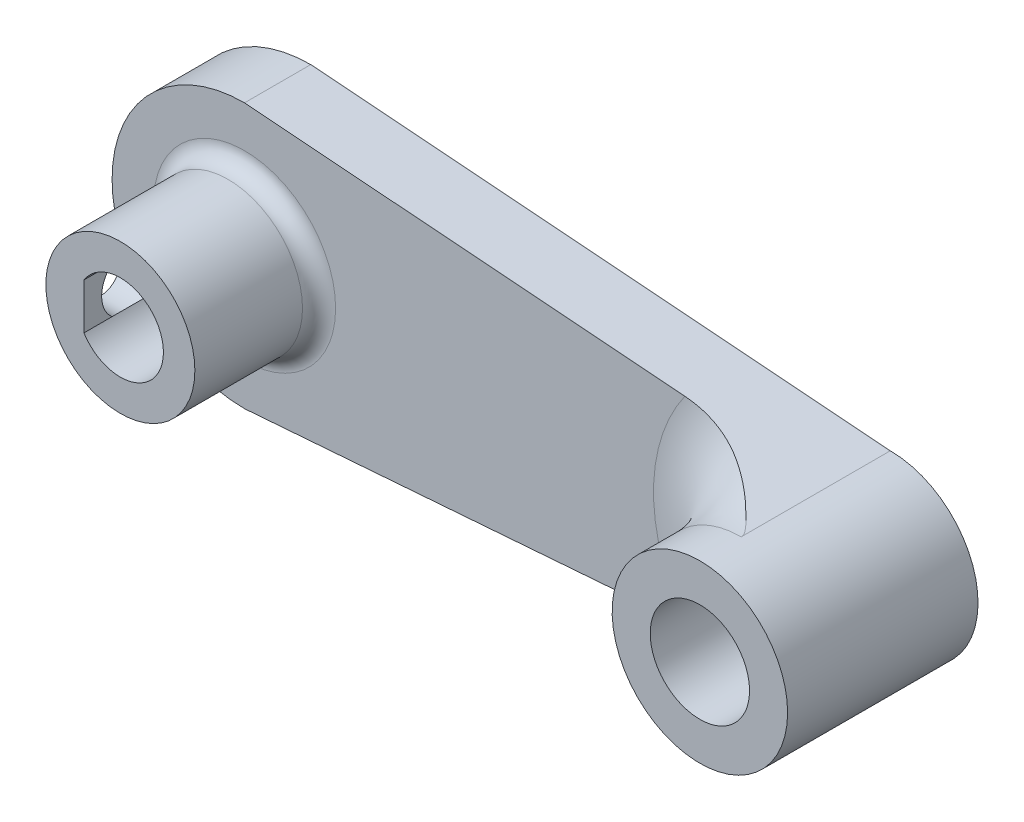
ISO-10303-21;
HEADER;
FILE_DESCRIPTION(('STEP AP214'),'2;1');
FILE_NAME('part.step','',(''),(''),'','','');
FILE_SCHEMA(('AUTOMOTIVE_DESIGN { 1 0 10303 214 1 1 1 1 }'));
ENDSEC;
DATA;
#1=APPLICATION_CONTEXT('core data for automotive mechanical design processes');
#2=APPLICATION_PROTOCOL_DEFINITION('international standard','automotive_design',2000,#1);
#3=PRODUCT_CONTEXT('',#1,'mechanical');
#4=PRODUCT('Part','Part','',(#3));
#5=PRODUCT_RELATED_PRODUCT_CATEGORY('part','',(#4));
#6=PRODUCT_DEFINITION_FORMATION('','',#4);
#7=PRODUCT_DEFINITION_CONTEXT('part definition',#1,'design');
#8=PRODUCT_DEFINITION('design','',#6,#7);
#9=PRODUCT_DEFINITION_SHAPE('','',#8);
#10=(LENGTH_UNIT() NAMED_UNIT(*) SI_UNIT(.MILLI.,.METRE.));
#11=(NAMED_UNIT(*) PLANE_ANGLE_UNIT() SI_UNIT($,.RADIAN.));
#12=(NAMED_UNIT(*) SI_UNIT($,.STERADIAN.) SOLID_ANGLE_UNIT());
#13=UNCERTAINTY_MEASURE_WITH_UNIT(LENGTH_MEASURE(1.E-05),#10,'distance_accuracy_value','');
#14=(GEOMETRIC_REPRESENTATION_CONTEXT(3) GLOBAL_UNCERTAINTY_ASSIGNED_CONTEXT((#13)) GLOBAL_UNIT_ASSIGNED_CONTEXT((#10,
#11,#12)) REPRESENTATION_CONTEXT('',''));
#15=CARTESIAN_POINT('',(0.,0.,0.));
#16=DIRECTION('',(0.,0.,1.));
#17=DIRECTION('',(1.,0.,0.));
#18=AXIS2_PLACEMENT_3D('',#15,#16,#17);
#19=CARTESIAN_POINT('',(-2.20040337211158,1.385,4.));
#20=DIRECTION('',(1.,0.,0.));
#21=DIRECTION('',(0.,0.,-1.));
#22=AXIS2_PLACEMENT_3D('',#19,#20,#21);
#23=PLANE('',#22);
#24=CARTESIAN_POINT('',(-2.20040337211158,0.,8.58156206194235));
#25=DIRECTION('',(1.,0.,0.));
#26=DIRECTION('',(0.,0.,-1.));
#27=AXIS2_PLACEMENT_3D('',#24,#25,#26);
#28=CIRCLE('',#27,1.85);
#29=CARTESIAN_POINT('',(-2.20040337211158,1.385,9.80805095304573));
#30=VERTEX_POINT('',#29);
#31=CARTESIAN_POINT('',(-2.20040337211158,-1.385,9.80805095304573));
#32=VERTEX_POINT('',#31);
#33=EDGE_CURVE('E138',#30,#32,#28,.T.);
#34=ORIENTED_EDGE('',*,*,#33,.F.);
#35=DIRECTION('',(0.,0.,-1.));
#36=VECTOR('',#35,1.);
#37=CARTESIAN_POINT('',(-2.20040337211158,1.385,4.));
#38=LINE('',#37,#36);
#39=CARTESIAN_POINT('',(-2.20040337211158,1.385,11.5));
#40=VERTEX_POINT('',#39);
#41=EDGE_CURVE('E150',#40,#30,#38,.T.);
#42=ORIENTED_EDGE('',*,*,#41,.F.);
#43=DIRECTION('',(0.,-1.,0.));
#44=VECTOR('',#43,1.);
#45=CARTESIAN_POINT('',(-2.20040337211158,1.385,11.5));
#46=LINE('',#45,#44);
#47=CARTESIAN_POINT('',(-2.20040337211158,-1.385,11.5));
#48=VERTEX_POINT('',#47);
#49=EDGE_CURVE('E312',#40,#48,#46,.T.);
#50=ORIENTED_EDGE('',*,*,#49,.T.);
#51=DIRECTION('',(0.,0.,-1.));
#52=VECTOR('',#51,1.);
#53=CARTESIAN_POINT('',(-2.20040337211158,-1.385,4.));
#54=LINE('',#53,#52);
#55=EDGE_CURVE('E148',#48,#32,#54,.T.);
#56=ORIENTED_EDGE('',*,*,#55,.T.);
#57=EDGE_LOOP('',(#34,#42,#50,#56));
#58=FACE_BOUND('',#57,.T.);
#59=ADVANCED_FACE('F41',(#58),#23,.T.);
#60=CARTESIAN_POINT('',(0.,0.,4.));
#61=DIRECTION('',(0.,0.,1.));
#62=DIRECTION('',(1.,0.,0.));
#63=AXIS2_PLACEMENT_3D('',#60,#61,#62);
#64=PLANE('',#63);
#65=CARTESIAN_POINT('',(0.,0.,4.));
#66=DIRECTION('',(0.,0.,1.));
#67=DIRECTION('',(1.,0.,0.));
#68=AXIS2_PLACEMENT_3D('',#65,#66,#67);
#69=CIRCLE('',#68,5.5);
#70=CARTESIAN_POINT('',(5.5,0.,4.));
#71=VERTEX_POINT('',#70);
#72=EDGE_CURVE('E206',#71,#71,#69,.F.);
#73=ORIENTED_EDGE('',*,*,#72,.T.);
#74=EDGE_LOOP('',(#73));
#75=FACE_BOUND('',#74,.T.);
#76=DIRECTION('',(0.997070106802791,0.0764931508062722,0.));
#77=VECTOR('',#76,1.);
#78=CARTESIAN_POINT('',(0.,-8.,4.));
#79=LINE('',#78,#77);
#80=CARTESIAN_POINT('',(0.,-8.,4.));
#81=VERTEX_POINT('',#80);
#82=CARTESIAN_POINT('',(26.5998702673474,-5.95931311759814,4.));
#83=VERTEX_POINT('',#82);
#84=EDGE_CURVE('E168',#81,#83,#79,.T.);
#85=ORIENTED_EDGE('',*,*,#84,.T.);
#86=CARTESIAN_POINT('',(35.,0.,4.));
#87=DIRECTION('',(0.,0.,1.));
#88=DIRECTION('',(1.,0.,0.));
#89=AXIS2_PLACEMENT_3D('',#86,#87,#88);
#90=CIRCLE('',#89,10.2993005762028);
#91=CARTESIAN_POINT('',(26.5919208086599,5.94809185126833,4.));
#92=VERTEX_POINT('',#91);
#93=EDGE_CURVE('E63',#83,#92,#90,.F.);
#94=ORIENTED_EDGE('',*,*,#93,.T.);
#95=DIRECTION('',(-0.997036176645934,0.0769341436506468,0.));
#96=VECTOR('',#95,1.);
#97=CARTESIAN_POINT('',(0.,8.,4.));
#98=LINE('',#97,#96);
#99=CARTESIAN_POINT('',(0.,8.,4.));
#100=VERTEX_POINT('',#99);
#101=EDGE_CURVE('E172',#92,#100,#98,.T.);
#102=ORIENTED_EDGE('',*,*,#101,.T.);
#103=CARTESIAN_POINT('',(0.,0.,4.));
#104=DIRECTION('',(0.,0.,1.));
#105=DIRECTION('',(1.,0.,0.));
#106=AXIS2_PLACEMENT_3D('',#103,#104,#105);
#107=CIRCLE('',#106,8.);
#108=EDGE_CURVE('E164',#100,#81,#107,.T.);
#109=ORIENTED_EDGE('',*,*,#108,.T.);
#110=EDGE_LOOP('',(#85,#94,#102,#109));
#111=FACE_BOUND('',#110,.T.);
#112=ADVANCED_FACE('F253',(#75,#111),#64,.T.);
#113=CARTESIAN_POINT('',(0.,0.,0.));
#114=DIRECTION('',(0.,0.,1.));
#115=DIRECTION('',(1.,0.,0.));
#116=AXIS2_PLACEMENT_3D('',#113,#114,#115);
#117=PLANE('',#116);
#118=CARTESIAN_POINT('',(35.,0.,0.));
#119=DIRECTION('',(0.,0.,1.));
#120=DIRECTION('',(1.,0.,0.));
#121=AXIS2_PLACEMENT_3D('',#118,#119,#120);
#122=CIRCLE('',#121,3.2);
#123=CARTESIAN_POINT('',(38.2,0.,0.));
#124=VERTEX_POINT('',#123);
#125=EDGE_CURVE('E156',#124,#124,#122,.T.);
#126=ORIENTED_EDGE('',*,*,#125,.T.);
#127=EDGE_LOOP('',(#126));
#128=FACE_BOUND('',#127,.T.);
#129=CARTESIAN_POINT('',(0.,0.,0.));
#130=DIRECTION('',(0.,0.,1.));
#131=DIRECTION('',(1.,0.,0.));
#132=AXIS2_PLACEMENT_3D('',#129,#130,#131);
#133=CIRCLE('',#132,8.);
#134=CARTESIAN_POINT('',(0.,8.,0.));
#135=VERTEX_POINT('',#134);
#136=CARTESIAN_POINT('',(0.,-8.,0.));
#137=VERTEX_POINT('',#136);
#138=EDGE_CURVE('E163',#135,#137,#133,.T.);
#139=ORIENTED_EDGE('',*,*,#138,.F.);
#140=DIRECTION('',(-0.997036176645934,0.0769341436506468,0.));
#141=VECTOR('',#140,1.);
#142=CARTESIAN_POINT('',(0.,8.,0.));
#143=LINE('',#142,#141);
#144=CARTESIAN_POINT('',(35.,5.2993005762028,0.));
#145=VERTEX_POINT('',#144);
#146=EDGE_CURVE('E169',#145,#135,#143,.T.);
#147=ORIENTED_EDGE('',*,*,#146,.F.);
#148=CARTESIAN_POINT('',(35.,0.,0.));
#149=DIRECTION('',(0.,0.,1.));
#150=DIRECTION('',(1.,0.,0.));
#151=AXIS2_PLACEMENT_3D('',#148,#149,#150);
#152=CIRCLE('',#151,5.2993005762028);
#153=CARTESIAN_POINT('',(35.4053601981432,-5.28377419149462,0.));
#154=VERTEX_POINT('',#153);
#155=EDGE_CURVE('E182',#154,#145,#152,.T.);
#156=ORIENTED_EDGE('',*,*,#155,.F.);
#157=DIRECTION('',(0.997070106802791,0.0764931508062722,0.));
#158=VECTOR('',#157,1.);
#159=CARTESIAN_POINT('',(0.,-8.,0.));
#160=LINE('',#159,#158);
#161=EDGE_CURVE('E179',#137,#154,#160,.T.);
#162=ORIENTED_EDGE('',*,*,#161,.F.);
#163=EDGE_LOOP('',(#139,#147,#156,#162));
#164=FACE_BOUND('',#163,.T.);
#165=CARTESIAN_POINT('',(0.,0.,0.));
#166=DIRECTION('',(0.,0.,1.));
#167=DIRECTION('',(1.,0.,0.));
#168=AXIS2_PLACEMENT_3D('',#165,#166,#167);
#169=CIRCLE('',#168,2.6);
#170=CARTESIAN_POINT('',(-2.20040337211158,-1.385,0.));
#171=VERTEX_POINT('',#170);
#172=CARTESIAN_POINT('',(-2.20040337211158,1.385,0.));
#173=VERTEX_POINT('',#172);
#174=EDGE_CURVE('E305',#171,#173,#169,.T.);
#175=ORIENTED_EDGE('',*,*,#174,.T.);
#176=DIRECTION('',(0.,-1.,0.));
#177=VECTOR('',#176,1.);
#178=CARTESIAN_POINT('',(-2.20040337211158,1.385,0.));
#179=LINE('',#178,#177);
#180=EDGE_CURVE('E143',#173,#171,#179,.T.);
#181=ORIENTED_EDGE('',*,*,#180,.T.);
#182=EDGE_LOOP('',(#175,#181));
#183=FACE_BOUND('',#182,.T.);
#184=ADVANCED_FACE('F258',(#128,#164,#183),#117,.F.);
#185=CARTESIAN_POINT('',(0.,0.,4.));
#186=DIRECTION('',(0.,0.,-1.));
#187=DIRECTION('',(-1.,0.,0.));
#188=AXIS2_PLACEMENT_3D('',#185,#186,#187);
#189=CYLINDRICAL_SURFACE('',#188,8.);
#190=ORIENTED_EDGE('',*,*,#138,.T.);
#191=DIRECTION('',(0.,0.,-1.));
#192=VECTOR('',#191,1.);
#193=CARTESIAN_POINT('',(0.,-8.,4.));
#194=LINE('',#193,#192);
#195=EDGE_CURVE('E198',#81,#137,#194,.T.);
#196=ORIENTED_EDGE('',*,*,#195,.F.);
#197=ORIENTED_EDGE('',*,*,#108,.F.);
#198=DIRECTION('',(0.,0.,-1.));
#199=VECTOR('',#198,1.);
#200=CARTESIAN_POINT('',(0.,8.,4.));
#201=LINE('',#200,#199);
#202=EDGE_CURVE('E175',#100,#135,#201,.T.);
#203=ORIENTED_EDGE('',*,*,#202,.T.);
#204=EDGE_LOOP('',(#190,#196,#197,#203));
#205=FACE_BOUND('',#204,.T.);
#206=ADVANCED_FACE('F270',(#205),#189,.T.);
#207=CARTESIAN_POINT('',(0.,-8.,4.));
#208=DIRECTION('',(-0.0764931508062722,0.997070106802791,0.));
#209=DIRECTION('',(-0.997070106802791,-0.0764931508062722,0.));
#210=AXIS2_PLACEMENT_3D('',#207,#208,#209);
#211=PLANE('',#210);
#212=ORIENTED_EDGE('',*,*,#161,.T.);
#213=DIRECTION('',(0.,0.,-1.));
#214=VECTOR('',#213,1.);
#215=CARTESIAN_POINT('',(35.4053601981432,-5.28377419149462,4.));
#216=LINE('',#215,#214);
#217=CARTESIAN_POINT('',(35.4053601981432,-5.28377419149462,9.));
#218=VERTEX_POINT('',#217);
#219=EDGE_CURVE('E194',#218,#154,#216,.T.);
#220=ORIENTED_EDGE('',*,*,#219,.F.);
#221=CARTESIAN_POINT('',(26.5998702673474,-5.95931311759814,4.));
#222=CARTESIAN_POINT('',(26.8132386211762,-5.9429439399893,3.99997392254403));
#223=CARTESIAN_POINT('',(27.0264846742696,-5.92658414503925,4.01009669839337));
#224=CARTESIAN_POINT('',(27.4509463745889,-5.89402032366653,4.04922944579764));
#225=CARTESIAN_POINT('',(27.6621645632361,-5.87781610227128,4.07821139459106));
#226=CARTESIAN_POINT('',(28.0789668038518,-5.84583989876233,4.15321756187651));
#227=CARTESIAN_POINT('',(28.2845878831228,-5.83006507599079,4.19903786066211));
#228=CARTESIAN_POINT('',(28.6917953620166,-5.79882496270292,4.30632586148612));
#229=CARTESIAN_POINT('',(28.8933797920704,-5.78335982328785,4.36780101042736));
#230=CARTESIAN_POINT('',(29.3744572623801,-5.74645255745486,4.53342856061496));
#231=CARTESIAN_POINT('',(29.6515230639646,-5.72519664375404,4.64470058661206));
#232=CARTESIAN_POINT('',(30.1946584009708,-5.68352842708766,4.89149070382841));
#233=CARTESIAN_POINT('',(30.4607241620949,-5.66311641367838,5.02701703349274));
#234=CARTESIAN_POINT('',(30.9827993475787,-5.62306388816092,5.31900980116569));
#235=CARTESIAN_POINT('',(31.2387529657888,-5.60342765738479,5.47557581134342));
#236=CARTESIAN_POINT('',(31.7398058723707,-5.56498791750733,5.80540470023674));
#237=CARTESIAN_POINT('',(31.9849001188991,-5.54618479520576,5.97867521845913));
#238=CARTESIAN_POINT('',(32.7925490747515,-5.48422364226673,6.58349516707241));
#239=CARTESIAN_POINT('',(33.3324613837962,-5.44280268962143,7.04517451614531));
#240=CARTESIAN_POINT('',(34.3798985112516,-5.36244548544504,8.00116907598813));
#241=CARTESIAN_POINT('',(34.8874528591123,-5.32350696847577,8.49545366836865));
#242=CARTESIAN_POINT('',(35.3984182836361,-5.28430676077902,8.99323715916587));
#243=CARTESIAN_POINT('',(35.401889239753,-5.28404047622403,8.99661857945717));
#244=CARTESIAN_POINT('',(35.4053601981432,-5.28377419149462,9.));
#245=B_SPLINE_CURVE_WITH_KNOTS('',3,(#221,#222,#223,#224,#225,#226,#227,#228,#229,#230,#231,
#232,#233,#234,#235,#236,#237,#238,#239,#240,#241,#242,#243,#244),.UNSPECIFIED.,.F.,.F.,(4,2,2,
2,2,2,2,2,2,2,2,4),(0.,0.641567182247231,1.28218323280429,1.91528391101597,2.54868631520907,
3.44524394732992,4.34210669265903,5.24337410978046,6.14505567850509,8.27576141205359,
10.4044940037782,10.4190532627927),.UNSPECIFIED.);
#246=EDGE_CURVE('E56',#218,#83,#245,.F.);
#247=ORIENTED_EDGE('',*,*,#246,.T.);
#248=ORIENTED_EDGE('',*,*,#84,.F.);
#249=ORIENTED_EDGE('',*,*,#195,.T.);
#250=EDGE_LOOP('',(#212,#220,#247,#248,#249));
#251=FACE_BOUND('',#250,.T.);
#252=ADVANCED_FACE('F279',(#251),#211,.F.);
#253=CARTESIAN_POINT('',(35.,0.,4.));
#254=DIRECTION('',(0.,0.,-1.));
#255=DIRECTION('',(-1.,0.,0.));
#256=AXIS2_PLACEMENT_3D('',#253,#254,#255);
#257=CYLINDRICAL_SURFACE('',#256,5.2993005762028);
#258=CARTESIAN_POINT('',(35.,0.,9.));
#259=DIRECTION('',(0.,0.,1.));
#260=DIRECTION('',(1.,0.,0.));
#261=AXIS2_PLACEMENT_3D('',#258,#259,#260);
#262=CIRCLE('',#261,5.2993005762028);
#263=CARTESIAN_POINT('',(35.,5.2993005762028,9.));
#264=VERTEX_POINT('',#263);
#265=EDGE_CURVE('E210',#264,#218,#262,.T.);
#266=ORIENTED_EDGE('',*,*,#265,.T.);
#267=ORIENTED_EDGE('',*,*,#219,.T.);
#268=ORIENTED_EDGE('',*,*,#155,.T.);
#269=DIRECTION('',(0.,0.,-1.));
#270=VECTOR('',#269,1.);
#271=CARTESIAN_POINT('',(35.,5.2993005762028,4.));
#272=LINE('',#271,#270);
#273=EDGE_CURVE('E190',#264,#145,#272,.T.);
#274=ORIENTED_EDGE('',*,*,#273,.F.);
#275=EDGE_LOOP('',(#266,#267,#268,#274));
#276=FACE_BOUND('',#275,.T.);
#277=CARTESIAN_POINT('',(35.,0.,11.5));
#278=DIRECTION('',(0.,0.,1.));
#279=DIRECTION('',(1.,0.,0.));
#280=AXIS2_PLACEMENT_3D('',#277,#278,#279);
#281=CIRCLE('',#280,5.2993005762028);
#282=CARTESIAN_POINT('',(40.2993005762028,0.,11.5));
#283=VERTEX_POINT('',#282);
#284=EDGE_CURVE('E325',#283,#283,#281,.T.);
#285=ORIENTED_EDGE('',*,*,#284,.F.);
#286=EDGE_LOOP('',(#285));
#287=FACE_BOUND('',#286,.T.);
#288=ADVANCED_FACE('F275',(#276,#287),#257,.T.);
#289=CARTESIAN_POINT('',(0.,8.,4.));
#290=DIRECTION('',(-0.0769341436506468,-0.997036176645934,0.));
#291=DIRECTION('',(0.997036176645934,-0.0769341436506468,0.));
#292=AXIS2_PLACEMENT_3D('',#289,#290,#291);
#293=PLANE('',#292);
#294=ORIENTED_EDGE('',*,*,#146,.T.);
#295=ORIENTED_EDGE('',*,*,#202,.F.);
#296=ORIENTED_EDGE('',*,*,#101,.F.);
#297=CARTESIAN_POINT('',(26.5919208086599,5.94809185126833,4.));
#298=CARTESIAN_POINT('',(26.8051605842276,5.93163766443957,3.99997389542849));
#299=CARTESIAN_POINT('',(27.0182785301913,5.91519287832915,4.01010673630318));
#300=CARTESIAN_POINT('',(27.4424816669492,5.88246015927157,4.0492874131764));
#301=CARTESIAN_POINT('',(27.6535693822087,5.86617203152951,4.07830746477213));
#302=CARTESIAN_POINT('',(28.0703811226492,5.83400965360839,4.15347518646677));
#303=CARTESIAN_POINT('',(28.2761380883871,5.81813286164237,4.19944178272287));
#304=CARTESIAN_POINT('',(28.6835823197541,5.78669330733145,4.30710423472807));
#305=CARTESIAN_POINT('',(28.8852676388674,5.77113069518523,4.36880743003734));
#306=CARTESIAN_POINT('',(29.3639854033241,5.7341914725958,4.53420622386028));
#307=CARTESIAN_POINT('',(29.6386554992673,5.712997147743,4.64480611106799));
#308=CARTESIAN_POINT('',(30.1770854976113,5.6714503595635,4.89003145259013));
#309=CARTESIAN_POINT('',(30.4408414459516,5.65109820134333,5.02466552192758));
#310=CARTESIAN_POINT('',(30.958037111555,5.61118991459803,5.31462430523333));
#311=CARTESIAN_POINT('',(31.2114333181569,5.59163714347911,5.47002649731549));
#312=CARTESIAN_POINT('',(31.7071533141849,5.55338598040375,5.79745658625287));
#313=CARTESIAN_POINT('',(31.9494792251469,5.53468742474358,5.96948127768369));
#314=CARTESIAN_POINT('',(32.4055202504863,5.49949800376181,6.31300470289831));
#315=CARTESIAN_POINT('',(32.6199932812932,5.48294865545551,6.48349954008582));
#316=CARTESIAN_POINT('',(33.0409910265507,5.4504632735116,6.83345244130637));
#317=CARTESIAN_POINT('',(33.2475268113917,5.43452638565121,7.0128971550213));
#318=CARTESIAN_POINT('',(33.5805818475522,5.40882691295832,7.31350048063011));
#319=CARTESIAN_POINT('',(33.7091477193419,5.39890640507653,7.43239401042852));
#320=CARTESIAN_POINT('',(33.9633465610935,5.37929170034943,7.67319741749072));
#321=CARTESIAN_POINT('',(34.0889808070951,5.36959740504127,7.7951059329703));
#322=CARTESIAN_POINT('',(34.2853989278592,5.3544412248821,7.99174637845935));
#323=CARTESIAN_POINT('',(34.3574434082321,5.34888206812122,8.0652085923432));
#324=CARTESIAN_POINT('',(34.4996468355534,5.33790924771469,8.21421459419294));
#325=CARTESIAN_POINT('',(34.5698020665728,5.33249587080068,8.28976196575932));
#326=CARTESIAN_POINT('',(34.690450386053,5.32318630374632,8.42657669618301));
#327=CARTESIAN_POINT('',(34.7417421132749,5.3192284883705,8.48711183823271));
#328=CARTESIAN_POINT('',(34.8146157810322,5.31360534915559,8.581081955263));
#329=CARTESIAN_POINT('',(34.8382214100703,5.31178387176296,8.61292041436684));
#330=CARTESIAN_POINT('',(34.8831100224831,5.30832013891502,8.67818363758521));
#331=CARTESIAN_POINT('',(34.9043967512895,5.30667759445153,8.7116057146904));
#332=CARTESIAN_POINT('',(34.9380569226609,5.30408028001074,8.77225313555896));
#333=CARTESIAN_POINT('',(34.9513322237828,5.3030559200653,8.79896336673625));
#334=CARTESIAN_POINT('',(34.9739636957225,5.30130961140166,8.85388544195868));
#335=CARTESIAN_POINT('',(34.9833485459243,5.30058544970073,8.88208450476221));
#336=CARTESIAN_POINT('',(34.9931202715783,5.29983143559092,8.92548061642464));
#337=CARTESIAN_POINT('',(34.9956612695484,5.29963536496939,8.94018687011352));
#338=CARTESIAN_POINT('',(34.9991191773591,5.29936854297991,8.96992039151783));
#339=CARTESIAN_POINT('',(35.0000213913867,5.29929892558264,8.9849493527923));
#340=CARTESIAN_POINT('',(35.,5.2993005762028,9.));
#341=B_SPLINE_CURVE_WITH_KNOTS('',3,(#297,#298,#299,#300,#301,#302,#303,#304,#305,#306,#307,
#308,#309,#310,#311,#312,#313,#314,#315,#316,#317,#318,#319,#320,#321,#322,#323,#324,#325,#326,
#327,#328,#329,#330,#331,#332,#333,#334,#335,#336,#337,#338,#339,#340),.UNSPECIFIED.,.F.,.F.,(4,
2,2,2,2,2,2,2,2,2,2,2,2,2,2,2,2,2,2,2,2,4),(0.,0.641202171131687,1.28146321474307,
1.91507248375818,2.54897781071211,3.4381413483161,4.32762424782039,5.22052327293435,
6.11325045685485,6.93640184446374,7.7583600826152,8.28450560013555,8.81041766279523,
9.11952342755051,9.42919832543136,9.66734408172639,9.78632575414892,9.90511230814192,
9.99448205851119,10.0831807515254,10.1278708354375,10.1729597360964),.UNSPECIFIED.);
#342=EDGE_CURVE('E11',#92,#264,#341,.T.);
#343=ORIENTED_EDGE('',*,*,#342,.T.);
#344=ORIENTED_EDGE('',*,*,#273,.T.);
#345=EDGE_LOOP('',(#294,#295,#296,#343,#344));
#346=FACE_BOUND('',#345,.T.);
#347=ADVANCED_FACE('F266',(#346),#293,.F.);
#348=CARTESIAN_POINT('',(35.,0.,4.));
#349=DIRECTION('',(0.,0.,-1.));
#350=DIRECTION('',(-1.,0.,0.));
#351=AXIS2_PLACEMENT_3D('',#348,#349,#350);
#352=CYLINDRICAL_SURFACE('',#351,3.2);
#353=CARTESIAN_POINT('',(35.,0.,4.));
#354=DIRECTION('',(0.,0.,1.));
#355=DIRECTION('',(1.,0.,0.));
#356=AXIS2_PLACEMENT_3D('',#353,#354,#355);
#357=CIRCLE('',#356,3.2);
#358=CARTESIAN_POINT('',(38.2,0.,4.));
#359=VERTEX_POINT('',#358);
#360=EDGE_CURVE('E321',#359,#359,#357,.T.);
#361=ORIENTED_EDGE('',*,*,#360,.T.);
#362=EDGE_LOOP('',(#361));
#363=FACE_BOUND('',#362,.T.);
#364=ORIENTED_EDGE('',*,*,#125,.F.);
#365=EDGE_LOOP('',(#364));
#366=FACE_BOUND('',#365,.T.);
#367=ADVANCED_FACE('F264',(#363,#366),#352,.F.);
#368=CARTESIAN_POINT('',(0.,0.,4.));
#369=DIRECTION('',(0.,0.,-1.));
#370=DIRECTION('',(-1.,0.,0.));
#371=AXIS2_PLACEMENT_3D('',#368,#369,#370);
#372=CYLINDRICAL_SURFACE('',#371,2.6);
#373=ORIENTED_EDGE('',*,*,#174,.F.);
#374=CARTESIAN_POINT('',(-2.20040337211158,-1.385,7.35507317083897));
#375=VERTEX_POINT('',#374);
#376=EDGE_CURVE('E311',#375,#171,#54,.T.);
#377=ORIENTED_EDGE('',*,*,#376,.F.);
#378=EDGE_CURVE('E341',#32,#375,#54,.T.);
#379=ORIENTED_EDGE('',*,*,#378,.F.);
#380=ORIENTED_EDGE('',*,*,#55,.F.);
#381=CARTESIAN_POINT('',(0.,0.,11.5));
#382=DIRECTION('',(0.,0.,1.));
#383=DIRECTION('',(-1.,0.,0.));
#384=AXIS2_PLACEMENT_3D('',#381,#382,#383);
#385=CIRCLE('',#384,2.6);
#386=EDGE_CURVE('E318',#48,#40,#385,.T.);
#387=ORIENTED_EDGE('',*,*,#386,.T.);
#388=ORIENTED_EDGE('',*,*,#41,.T.);
#389=CARTESIAN_POINT('',(-2.20040337211158,1.385,7.35507317083897));
#390=VERTEX_POINT('',#389);
#391=EDGE_CURVE('E135',#30,#390,#38,.T.);
#392=ORIENTED_EDGE('',*,*,#391,.T.);
#393=EDGE_CURVE('E140',#390,#173,#38,.T.);
#394=ORIENTED_EDGE('',*,*,#393,.T.);
#395=EDGE_LOOP('',(#373,#377,#379,#380,#387,#388,#392,#394));
#396=FACE_BOUND('',#395,.T.);
#397=ADVANCED_FACE('F152',(#396),#372,.F.);
#398=EDGE_CURVE('E118',#375,#390,#28,.T.);
#399=ORIENTED_EDGE('',*,*,#398,.F.);
#400=ORIENTED_EDGE('',*,*,#376,.T.);
#401=ORIENTED_EDGE('',*,*,#180,.F.);
#402=ORIENTED_EDGE('',*,*,#393,.F.);
#403=EDGE_LOOP('',(#399,#400,#401,#402));
#404=FACE_BOUND('',#403,.T.);
#405=ADVANCED_FACE('F141',(#404),#23,.T.);
#406=CARTESIAN_POINT('',(0.,0.,11.5));
#407=DIRECTION('',(0.,0.,1.));
#408=DIRECTION('',(1.,0.,0.));
#409=AXIS2_PLACEMENT_3D('',#406,#407,#408);
#410=PLANE('',#409);
#411=CARTESIAN_POINT('',(0.,0.,11.5));
#412=DIRECTION('',(0.,0.,1.));
#413=DIRECTION('',(1.,0.,0.));
#414=AXIS2_PLACEMENT_3D('',#411,#412,#413);
#415=CIRCLE('',#414,4.5);
#416=CARTESIAN_POINT('',(4.5,0.,11.5));
#417=VERTEX_POINT('',#416);
#418=EDGE_CURVE('E307',#417,#417,#415,.T.);
#419=ORIENTED_EDGE('',*,*,#418,.T.);
#420=EDGE_LOOP('',(#419));
#421=FACE_BOUND('',#420,.T.);
#422=ORIENTED_EDGE('',*,*,#49,.F.);
#423=ORIENTED_EDGE('',*,*,#386,.F.);
#424=EDGE_LOOP('',(#422,#423));
#425=FACE_BOUND('',#424,.T.);
#426=ADVANCED_FACE('F242',(#421,#425),#410,.T.);
#427=CARTESIAN_POINT('',(0.,0.,11.5));
#428=DIRECTION('',(0.,0.,-1.));
#429=DIRECTION('',(-1.,0.,0.));
#430=AXIS2_PLACEMENT_3D('',#427,#428,#429);
#431=CYLINDRICAL_SURFACE('',#430,4.5);
#432=CARTESIAN_POINT('',(-4.5,0.,10.4315620619424));
#433=CARTESIAN_POINT('',(-4.49999236049547,-0.0992099846473282,10.431551846103));
#434=CARTESIAN_POINT('',(-4.49668093327062,-0.198581616826438,10.4235341043957));
#435=CARTESIAN_POINT('',(-4.48375548698992,-0.39451363999919,10.3917453058325));
#436=CARTESIAN_POINT('',(-4.47412478528336,-0.491065881222446,10.367932548905));
#437=CARTESIAN_POINT('',(-4.44959666323133,-0.678205527544849,10.305576812623));
#438=CARTESIAN_POINT('',(-4.43471689882294,-0.768811735841189,10.2670831796056));
#439=CARTESIAN_POINT('',(-4.40114509742087,-0.942194627657636,10.1766593644735));
#440=CARTESIAN_POINT('',(-4.38245427209446,-1.02497378745198,10.1247334515361));
#441=CARTESIAN_POINT('',(-4.34210958142232,-1.18455078339075,10.0062215559351));
#442=CARTESIAN_POINT('',(-4.3203603642406,-1.26091325562118,9.93908207976621));
#443=CARTESIAN_POINT('',(-4.27677097947424,-1.40166682202359,9.7932184368471));
#444=CARTESIAN_POINT('',(-4.25493077102076,-1.46605176619203,9.71448835572385));
#445=CARTESIAN_POINT('',(-4.21247158980418,-1.58404764830715,9.5431324672559));
#446=CARTESIAN_POINT('',(-4.19196023865163,-1.6369998313775,9.45002359494144));
#447=CARTESIAN_POINT('',(-4.15598778045605,-1.72629674442563,9.25525362026606));
#448=CARTESIAN_POINT('',(-4.14052414112787,-1.76264980534552,9.15359683842437));
#449=CARTESIAN_POINT('',(-4.11742715727602,-1.81593111361932,8.94962564404326));
#450=CARTESIAN_POINT('',(-4.10945841536966,-1.83369587103351,8.84756916217449));
#451=CARTESIAN_POINT('',(-4.10128632974971,-1.85190729794881,8.64163669087306));
#452=CARTESIAN_POINT('',(-4.10107886397237,-1.85236316031745,8.53776169659462));
#453=CARTESIAN_POINT('',(-4.10816815103326,-1.83657521293137,8.33937168862181));
#454=CARTESIAN_POINT('',(-4.11490884286835,-1.8215688774497,8.24473437913139));
#455=CARTESIAN_POINT('',(-4.13419740300247,-1.77735404016667,8.0594637674831));
#456=CARTESIAN_POINT('',(-4.14674634924682,-1.74814290206612,7.96883121198336));
#457=CARTESIAN_POINT('',(-4.17651849053049,-1.67578213381393,7.7918873026308));
#458=CARTESIAN_POINT('',(-4.19383431738772,-1.63235265697075,7.70570667605852));
#459=CARTESIAN_POINT('',(-4.23116628501091,-1.53298537325918,7.54152727345664));
#460=CARTESIAN_POINT('',(-4.2511834731106,-1.47704270939573,7.46353169177058));
#461=CARTESIAN_POINT('',(-4.29366199536257,-1.34884526213662,7.31120003082037));
#462=CARTESIAN_POINT('',(-4.31618909934486,-1.27562857991851,7.23768954219136));
#463=CARTESIAN_POINT('',(-4.35975961238261,-1.11767749110131,7.10371771937427));
#464=CARTESIAN_POINT('',(-4.38080269122451,-1.03294053330527,7.04325928329588));
#465=CARTESIAN_POINT('',(-4.41961617678893,-0.851901957295007,6.93594058412035));
#466=CARTESIAN_POINT('',(-4.43730469482149,-0.755387480342297,6.88940760046915));
#467=CARTESIAN_POINT('',(-4.46679079367851,-0.554987870880777,6.81352628947532));
#468=CARTESIAN_POINT('',(-4.47859154089803,-0.45110673450878,6.78416872386375));
#469=CARTESIAN_POINT('',(-4.49438583707553,-0.245829096704424,6.74517986881034));
#470=CARTESIAN_POINT('',(-4.49881739761436,-0.144676766033121,6.7344401063005));
#471=CARTESIAN_POINT('',(-4.50076591507613,0.0580730502496339,6.72969769694391));
#472=CARTESIAN_POINT('',(-4.49828479095705,0.159670404505202,6.73569040517222));
#473=CARTESIAN_POINT('',(-4.48697177202371,0.355291890944609,6.7634418220086));
#474=CARTESIAN_POINT('',(-4.47845062287308,0.449445393816876,6.78442947882141));
#475=CARTESIAN_POINT('',(-4.45624301708188,0.632797445209041,6.8405100203684));
#476=CARTESIAN_POINT('',(-4.44255590383832,0.721995362211387,6.87560469816628));
#477=CARTESIAN_POINT('',(-4.41080778328087,0.896015470051197,6.96005044650571));
#478=CARTESIAN_POINT('',(-4.39262456399527,0.980616927107149,7.00980896678325));
#479=CARTESIAN_POINT('',(-4.35383551109427,1.14057051488669,7.12172088301977));
#480=CARTESIAN_POINT('',(-4.33322867991585,1.21591881072508,7.18387939021547));
#481=CARTESIAN_POINT('',(-4.2900455822829,1.36073933130225,7.3238957070961));
#482=CARTESIAN_POINT('',(-4.26743210606218,1.4294368522152,7.40254539667444));
#483=CARTESIAN_POINT('',(-4.22408542652514,1.55286594976441,7.5706312397597));
#484=CARTESIAN_POINT('',(-4.20335260954645,1.60759466100353,7.66006960079571));
#485=CARTESIAN_POINT('',(-4.16601640868377,1.70203718479411,7.84886631975386));
#486=CARTESIAN_POINT('',(-4.14946855531543,1.74155238749134,7.94833581312334));
#487=CARTESIAN_POINT('',(-4.12316872602981,1.80294650188405,8.15340824004015));
#488=CARTESIAN_POINT('',(-4.11341134727119,1.82483943691475,8.25900622480444));
#489=CARTESIAN_POINT('',(-4.10260751406838,1.84899174856933,8.46476682437599));
#490=CARTESIAN_POINT('',(-4.10096026313642,1.85260582383811,8.56473969903013));
#491=CARTESIAN_POINT('',(-4.10497439053343,1.84369455080225,8.76380371522511));
#492=CARTESIAN_POINT('',(-4.11063471622209,1.83117152701168,8.86289498168954));
#493=CARTESIAN_POINT('',(-4.12808343237869,1.79146916380664,9.05288621080006));
#494=CARTESIAN_POINT('',(-4.13959040580574,1.7649609059975,9.14395468286381));
#495=CARTESIAN_POINT('',(-4.16722266946965,1.69868695877268,9.32037790706559));
#496=CARTESIAN_POINT('',(-4.18334925001667,1.65891756485717,9.40573105461769));
#497=CARTESIAN_POINT('',(-4.21958819815847,1.56453551372486,9.57381293449863));
#498=CARTESIAN_POINT('',(-4.23988001929758,1.50918345020272,9.65608709084518));
#499=CARTESIAN_POINT('',(-4.28164680559803,1.38625789267435,9.8106037097558));
#500=CARTESIAN_POINT('',(-4.30312216164676,1.31868034391859,9.88284282996766));
#501=CARTESIAN_POINT('',(-4.34664507515044,1.16759273059439,10.0204443364174));
#502=CARTESIAN_POINT('',(-4.36862721065428,1.083297865062,10.0849696578427));
#503=CARTESIAN_POINT('',(-4.40916489977816,0.904254815000999,10.1989931894907));
#504=CARTESIAN_POINT('',(-4.4277188822875,0.809501869188949,10.2484845163445));
#505=CARTESIAN_POINT('',(-4.45902477593764,0.61380062914342,10.3299306936255));
#506=CARTESIAN_POINT('',(-4.47187155136231,0.512987949193933,10.3621742400106));
#507=CARTESIAN_POINT('',(-4.49070363335878,0.306918456874384,10.4089623334052));
#508=CARTESIAN_POINT('',(-4.49671051972127,0.201676713998354,10.4235625539356));
#509=CARTESIAN_POINT('',(-4.49966020128979,0.0640777420227655,10.4307331154295));
#510=CARTESIAN_POINT('',(-4.5000024677509,0.0320473045790341,10.4315653619138));
#511=CARTESIAN_POINT('',(-4.5,0.,10.4315620619424));
#512=B_SPLINE_CURVE_WITH_KNOTS('',3,(#432,#433,#434,#435,#436,#437,#438,#439,#440,#441,#442,
#443,#444,#445,#446,#447,#448,#449,#450,#451,#452,#453,#454,#455,#456,#457,#458,#459,#460,#461,
#462,#463,#464,#465,#466,#467,#468,#469,#470,#471,#472,#473,#474,#475,#476,#477,#478,#479,#480,
#481,#482,#483,#484,#485,#486,#487,#488,#489,#490,#491,#492,#493,#494,#495,#496,#497,#498,#499,
#500,#501,#502,#503,#504,#505,#506,#507,#508,#509,#510,#511),.UNSPECIFIED.,.T.,.F.,(4,2,2,2,2,2,
2,2,2,2,2,2,2,2,2,2,2,2,2,2,2,2,2,2,2,2,2,2,2,2,2,2,2,2,2,2,2,2,2,4),(0.,0.297540582947049,
0.595869839547188,0.893205045806391,1.19044586597339,1.50103100121824,1.8117751725492,
2.1373113427365,2.46268394933211,2.77268579124664,3.08252298684805,3.3693540848375,
3.6562384367421,3.94914782202729,4.24217109802752,4.55924132054266,4.8763818738596,
5.20047723256776,5.52439810705999,5.8282702256239,6.13205799783743,6.42125509742057,
6.7104889668417,7.00867059543497,7.30697538849607,7.62605550077852,7.9452010128906,
8.26838203353541,8.59130562029762,8.88990462789539,9.18846062776245,9.47384304955477,
9.75930525983863,10.0616685942123,10.3641323959898,10.687799301619,11.0116141767244,
11.3298244519869,11.6470279704368,11.7431410151089),.UNSPECIFIED.);
#513=CARTESIAN_POINT('',(-4.5,0.,10.4315620619424));
#514=VERTEX_POINT('',#513);
#515=EDGE_CURVE('E137',#514,#514,#512,.T.);
#516=ORIENTED_EDGE('',*,*,#515,.T.);
#517=EDGE_LOOP('',(#516));
#518=FACE_BOUND('',#517,.T.);
#519=CARTESIAN_POINT('',(0.,0.,5.));
#520=DIRECTION('',(0.,0.,1.));
#521=DIRECTION('',(1.,0.,0.));
#522=AXIS2_PLACEMENT_3D('',#519,#520,#521);
#523=CIRCLE('',#522,4.5);
#524=CARTESIAN_POINT('',(4.5,0.,5.));
#525=VERTEX_POINT('',#524);
#526=EDGE_CURVE('E202',#525,#525,#523,.T.);
#527=ORIENTED_EDGE('',*,*,#526,.T.);
#528=EDGE_LOOP('',(#527));
#529=FACE_BOUND('',#528,.T.);
#530=ORIENTED_EDGE('',*,*,#418,.F.);
#531=EDGE_LOOP('',(#530));
#532=FACE_BOUND('',#531,.T.);
#533=ADVANCED_FACE('F221',(#518,#529,#532),#431,.T.);
#534=CARTESIAN_POINT('',(0.,0.,5.));
#535=DIRECTION('',(0.,0.,1.));
#536=DIRECTION('',(1.,0.,0.));
#537=AXIS2_PLACEMENT_3D('',#534,#535,#536);
#538=TOROIDAL_SURFACE('',#537,5.5,1.);
#539=ORIENTED_EDGE('',*,*,#72,.F.);
#540=EDGE_LOOP('',(#539));
#541=FACE_BOUND('',#540,.T.);
#542=ORIENTED_EDGE('',*,*,#526,.F.);
#543=EDGE_LOOP('',(#542));
#544=FACE_BOUND('',#543,.T.);
#545=ADVANCED_FACE('F240',(#541,#544),#538,.F.);
#546=CARTESIAN_POINT('',(35.,0.,4.));
#547=DIRECTION('',(0.,0.,1.));
#548=DIRECTION('',(1.,0.,0.));
#549=AXIS2_PLACEMENT_3D('',#546,#547,#548);
#550=PLANE('',#549);
#551=CARTESIAN_POINT('',(35.,0.,4.));
#552=DIRECTION('',(0.,0.,1.));
#553=DIRECTION('',(1.,0.,0.));
#554=AXIS2_PLACEMENT_3D('',#551,#552,#553);
#555=CIRCLE('',#554,3.);
#556=CARTESIAN_POINT('',(38.,0.,4.));
#557=VERTEX_POINT('',#556);
#558=EDGE_CURVE('E329',#557,#557,#555,.T.);
#559=ORIENTED_EDGE('',*,*,#558,.T.);
#560=EDGE_LOOP('',(#559));
#561=FACE_BOUND('',#560,.T.);
#562=ORIENTED_EDGE('',*,*,#360,.F.);
#563=EDGE_LOOP('',(#562));
#564=FACE_BOUND('',#563,.T.);
#565=ADVANCED_FACE('F237',(#561,#564),#550,.F.);
#566=CARTESIAN_POINT('',(35.,0.,26.4886854919151));
#567=DIRECTION('',(0.,0.,-1.));
#568=DIRECTION('',(-1.,0.,0.));
#569=AXIS2_PLACEMENT_3D('',#566,#567,#568);
#570=CYLINDRICAL_SURFACE('',#569,3.);
#571=ORIENTED_EDGE('',*,*,#558,.F.);
#572=EDGE_LOOP('',(#571));
#573=FACE_BOUND('',#572,.T.);
#574=CARTESIAN_POINT('',(35.,0.,11.5));
#575=DIRECTION('',(0.,0.,1.));
#576=DIRECTION('',(1.,0.,0.));
#577=AXIS2_PLACEMENT_3D('',#574,#575,#576);
#578=CIRCLE('',#577,3.);
#579=CARTESIAN_POINT('',(38.,0.,11.5));
#580=VERTEX_POINT('',#579);
#581=EDGE_CURVE('E219',#580,#580,#578,.T.);
#582=ORIENTED_EDGE('',*,*,#581,.T.);
#583=EDGE_LOOP('',(#582));
#584=FACE_BOUND('',#583,.T.);
#585=ADVANCED_FACE('F233',(#573,#584),#570,.F.);
#586=CARTESIAN_POINT('',(0.,0.,11.5));
#587=DIRECTION('',(0.,0.,1.));
#588=DIRECTION('',(1.,0.,0.));
#589=AXIS2_PLACEMENT_3D('',#586,#587,#588);
#590=PLANE('',#589);
#591=ORIENTED_EDGE('',*,*,#581,.F.);
#592=EDGE_LOOP('',(#591));
#593=FACE_BOUND('',#592,.T.);
#594=ORIENTED_EDGE('',*,*,#284,.T.);
#595=EDGE_LOOP('',(#594));
#596=FACE_BOUND('',#595,.T.);
#597=ADVANCED_FACE('F230',(#593,#596),#590,.T.);
#598=CARTESIAN_POINT('',(-2.20040337211158,0.,8.58156206194235));
#599=DIRECTION('',(1.,0.,0.));
#600=DIRECTION('',(0.,0.,-1.));
#601=AXIS2_PLACEMENT_3D('',#598,#599,#600);
#602=PLANE('',#601);
#603=ORIENTED_EDGE('',*,*,#378,.T.);
#604=EDGE_CURVE('E125',#32,#375,#28,.T.);
#605=ORIENTED_EDGE('',*,*,#604,.F.);
#606=EDGE_LOOP('',(#603,#605));
#607=FACE_BOUND('',#606,.T.);
#608=ADVANCED_FACE('F229',(#607),#602,.F.);
#609=CARTESIAN_POINT('',(-8.20040337211158,0.,8.58156206194235));
#610=DIRECTION('',(1.,0.,0.));
#611=DIRECTION('',(0.,0.,-1.));
#612=AXIS2_PLACEMENT_3D('',#609,#610,#611);
#613=CYLINDRICAL_SURFACE('',#612,1.85);
#614=EDGE_CURVE('E123',#390,#30,#28,.T.);
#615=ORIENTED_EDGE('',*,*,#614,.T.);
#616=ORIENTED_EDGE('',*,*,#33,.T.);
#617=ORIENTED_EDGE('',*,*,#604,.T.);
#618=ORIENTED_EDGE('',*,*,#398,.T.);
#619=EDGE_LOOP('',(#615,#616,#617,#618));
#620=FACE_BOUND('',#619,.T.);
#621=ORIENTED_EDGE('',*,*,#515,.F.);
#622=EDGE_LOOP('',(#621));
#623=FACE_BOUND('',#622,.T.);
#624=ADVANCED_FACE('F120',(#620,#623),#613,.F.);
#625=ORIENTED_EDGE('',*,*,#391,.F.);
#626=ORIENTED_EDGE('',*,*,#614,.F.);
#627=EDGE_LOOP('',(#625,#626));
#628=FACE_BOUND('',#627,.T.);
#629=ADVANCED_FACE('F133',(#628),#602,.F.);
#630=CARTESIAN_POINT('',(35.,0.,9.));
#631=DIRECTION('',(0.,0.,1.));
#632=DIRECTION('',(1.,0.,0.));
#633=AXIS2_PLACEMENT_3D('',#630,#631,#632);
#634=TOROIDAL_SURFACE('',#633,10.2993005762028,5.);
#635=ORIENTED_EDGE('',*,*,#342,.F.);
#636=ORIENTED_EDGE('',*,*,#93,.F.);
#637=ORIENTED_EDGE('',*,*,#246,.F.);
#638=ORIENTED_EDGE('',*,*,#265,.F.);
#639=EDGE_LOOP('',(#635,#636,#637,#638));
#640=FACE_BOUND('',#639,.T.);
#641=ADVANCED_FACE('F43',(#640),#634,.F.);
#642=CLOSED_SHELL('',(#59,#112,#184,#206,#252,#288,#347,#367,#397,#405,#426,#533,#545,#565,#585,
#597,#608,#624,#629,#641));
#643=MANIFOLD_SOLID_BREP('B2',#642);
#644=ADVANCED_BREP_SHAPE_REPRESENTATION('',(#18,#643),#14);
#645=SHAPE_DEFINITION_REPRESENTATION(#9,#644);
ENDSEC;
END-ISO-10303-21;
